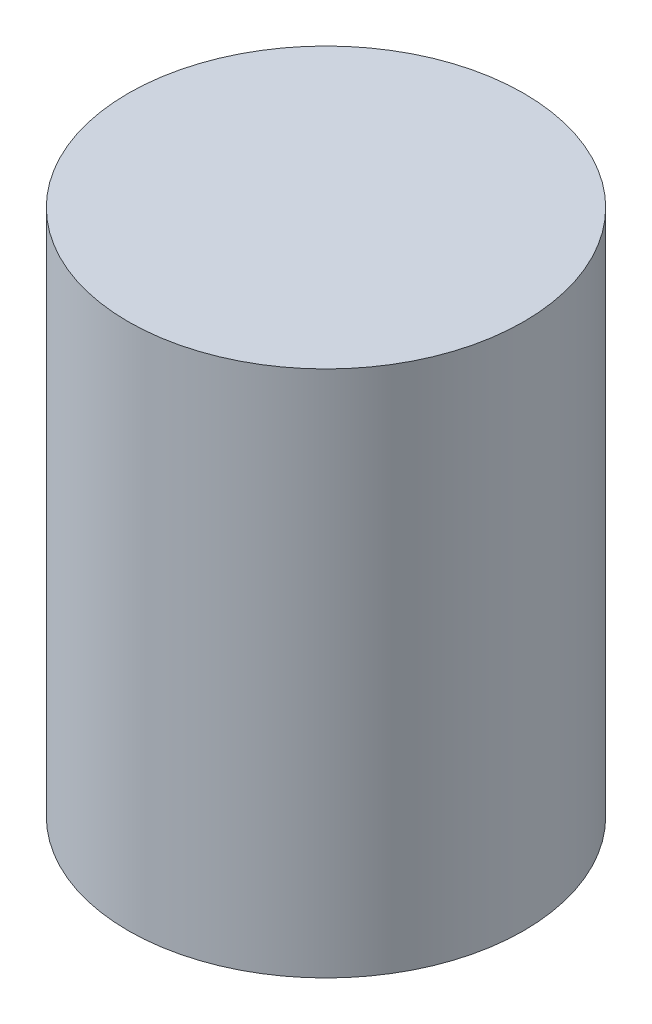
ISO-10303-21;
HEADER;
FILE_DESCRIPTION(('STEP AP214'),'2;1');
FILE_NAME('part.step','',(''),(''),'','','');
FILE_SCHEMA(('AUTOMOTIVE_DESIGN { 1 0 10303 214 1 1 1 1 }'));
ENDSEC;
DATA;
#1=APPLICATION_CONTEXT('core data for automotive mechanical design processes');
#2=APPLICATION_PROTOCOL_DEFINITION('international standard','automotive_design',2000,#1);
#3=PRODUCT_CONTEXT('',#1,'mechanical');
#4=PRODUCT('Part','Part','',(#3));
#5=PRODUCT_RELATED_PRODUCT_CATEGORY('part','',(#4));
#6=PRODUCT_DEFINITION_FORMATION('','',#4);
#7=PRODUCT_DEFINITION_CONTEXT('part definition',#1,'design');
#8=PRODUCT_DEFINITION('design','',#6,#7);
#9=PRODUCT_DEFINITION_SHAPE('','',#8);
#10=(LENGTH_UNIT() NAMED_UNIT(*) SI_UNIT(.MILLI.,.METRE.));
#11=(NAMED_UNIT(*) PLANE_ANGLE_UNIT() SI_UNIT($,.RADIAN.));
#12=(NAMED_UNIT(*) SI_UNIT($,.STERADIAN.) SOLID_ANGLE_UNIT());
#13=UNCERTAINTY_MEASURE_WITH_UNIT(LENGTH_MEASURE(1.E-05),#10,'distance_accuracy_value','');
#14=(GEOMETRIC_REPRESENTATION_CONTEXT(3) GLOBAL_UNCERTAINTY_ASSIGNED_CONTEXT((#13)) GLOBAL_UNIT_ASSIGNED_CONTEXT((#10,
#11,#12)) REPRESENTATION_CONTEXT('',''));
#15=CARTESIAN_POINT('',(0.,0.,0.));
#16=DIRECTION('',(0.,0.,1.));
#17=DIRECTION('',(1.,0.,0.));
#18=AXIS2_PLACEMENT_3D('',#15,#16,#17);
#19=CARTESIAN_POINT('',(0.,40.,0.));
#20=DIRECTION('',(0.,-1.,0.));
#21=DIRECTION('',(0.,0.,-1.));
#22=AXIS2_PLACEMENT_3D('',#19,#20,#21);
#23=CYLINDRICAL_SURFACE('',#22,30.);
#24=CARTESIAN_POINT('',(0.,40.,0.));
#25=DIRECTION('',(0.,1.,0.));
#26=DIRECTION('',(0.,0.,1.));
#27=AXIS2_PLACEMENT_3D('',#24,#25,#26);
#28=CIRCLE('',#27,30.);
#29=CARTESIAN_POINT('',(0.,40.,30.));
#30=VERTEX_POINT('',#29);
#31=EDGE_CURVE('E10',#30,#30,#28,.T.);
#32=ORIENTED_EDGE('',*,*,#31,.F.);
#33=EDGE_LOOP('',(#32));
#34=FACE_BOUND('',#33,.T.);
#35=CARTESIAN_POINT('',(0.,-40.,0.));
#36=DIRECTION('',(0.,1.,0.));
#37=DIRECTION('',(0.,0.,1.));
#38=AXIS2_PLACEMENT_3D('',#35,#36,#37);
#39=CIRCLE('',#38,30.);
#40=CARTESIAN_POINT('',(0.,-40.,30.));
#41=VERTEX_POINT('',#40);
#42=EDGE_CURVE('E44',#41,#41,#39,.T.);
#43=ORIENTED_EDGE('',*,*,#42,.T.);
#44=EDGE_LOOP('',(#43));
#45=FACE_BOUND('',#44,.T.);
#46=ADVANCED_FACE('F41',(#34,#45),#23,.T.);
#47=CARTESIAN_POINT('',(0.,40.,0.));
#48=DIRECTION('',(0.,1.,0.));
#49=DIRECTION('',(0.,0.,1.));
#50=AXIS2_PLACEMENT_3D('',#47,#48,#49);
#51=PLANE('',#50);
#52=ORIENTED_EDGE('',*,*,#31,.T.);
#53=EDGE_LOOP('',(#52));
#54=FACE_BOUND('',#53,.T.);
#55=ADVANCED_FACE('F58',(#54),#51,.T.);
#56=CARTESIAN_POINT('',(0.,-40.,0.));
#57=DIRECTION('',(0.,1.,0.));
#58=DIRECTION('',(0.,0.,1.));
#59=AXIS2_PLACEMENT_3D('',#56,#57,#58);
#60=PLANE('',#59);
#61=ORIENTED_EDGE('',*,*,#42,.F.);
#62=EDGE_LOOP('',(#61));
#63=FACE_BOUND('',#62,.T.);
#64=ADVANCED_FACE('F56',(#63),#60,.F.);
#65=CLOSED_SHELL('',(#46,#55,#64));
#66=MANIFOLD_SOLID_BREP('B2',#65);
#67=ADVANCED_BREP_SHAPE_REPRESENTATION('',(#18,#66),#14);
#68=SHAPE_DEFINITION_REPRESENTATION(#9,#67);
ENDSEC;
END-ISO-10303-21;
